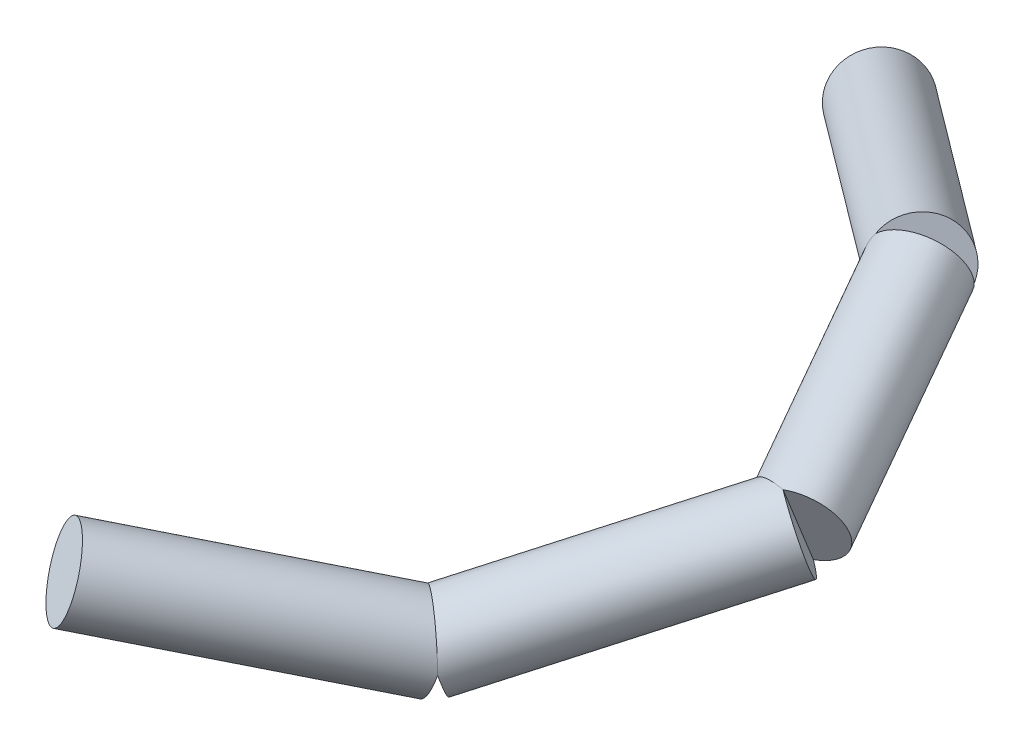
ISO-10303-21;
HEADER;
FILE_DESCRIPTION(('STEP AP214'),'2;1');
FILE_NAME('part.step','',(''),(''),'','','');
FILE_SCHEMA(('AUTOMOTIVE_DESIGN { 1 0 10303 214 1 1 1 1 }'));
ENDSEC;
DATA;
#1=APPLICATION_CONTEXT('core data for automotive mechanical design processes');
#2=APPLICATION_PROTOCOL_DEFINITION('international standard','automotive_design',2000,#1);
#3=PRODUCT_CONTEXT('',#1,'mechanical');
#4=PRODUCT('Part','Part','',(#3));
#5=PRODUCT_RELATED_PRODUCT_CATEGORY('part','',(#4));
#6=PRODUCT_DEFINITION_FORMATION('','',#4);
#7=PRODUCT_DEFINITION_CONTEXT('part definition',#1,'design');
#8=PRODUCT_DEFINITION('design','',#6,#7);
#9=PRODUCT_DEFINITION_SHAPE('','',#8);
#10=(LENGTH_UNIT() NAMED_UNIT(*) SI_UNIT(.MILLI.,.METRE.));
#11=(NAMED_UNIT(*) PLANE_ANGLE_UNIT() SI_UNIT($,.RADIAN.));
#12=(NAMED_UNIT(*) SI_UNIT($,.STERADIAN.) SOLID_ANGLE_UNIT());
#13=UNCERTAINTY_MEASURE_WITH_UNIT(LENGTH_MEASURE(1.E-05),#10,'distance_accuracy_value','');
#14=(GEOMETRIC_REPRESENTATION_CONTEXT(3) GLOBAL_UNCERTAINTY_ASSIGNED_CONTEXT((#13)) GLOBAL_UNIT_ASSIGNED_CONTEXT((#10,
#11,#12)) REPRESENTATION_CONTEXT('',''));
#15=CARTESIAN_POINT('',(0.,0.,0.));
#16=DIRECTION('',(0.,0.,1.));
#17=DIRECTION('',(1.,0.,0.));
#18=AXIS2_PLACEMENT_3D('',#15,#16,#17);
#19=CARTESIAN_POINT('',(0.,0.,0.));
#20=DIRECTION('',(0.744208407535235,0.248069469178078,0.620173672946196));
#21=DIRECTION('',(0.,-0.928476690885466,0.371390676353587));
#22=AXIS2_PLACEMENT_3D('',#19,#20,#21);
#23=PLANE('',#22);
#24=CARTESIAN_POINT('',(0.,0.,0.));
#25=DIRECTION('',(0.744208407535374,0.248069469178054,0.62017367294604));
#26=DIRECTION('',(0.658156305651327,-0.113947898116057,-0.744208407535369));
#27=AXIS2_PLACEMENT_3D('',#24,#25,#26);
#28=CIRCLE('',#27,10.);
#29=CARTESIAN_POINT('',(6.581563056514,-1.139478981162,-7.442084075353));
#30=VERTEX_POINT('',#29);
#31=EDGE_CURVE('E10',#30,#30,#28,.T.);
#32=ORIENTED_EDGE('',*,*,#31,.F.);
#33=EDGE_LOOP('',(#32));
#34=FACE_BOUND('',#33,.T.);
#35=ADVANCED_FACE('F16',(#34),#23,.F.);
#36=CARTESIAN_POINT('',(60.,20.,50.));
#37=DIRECTION('',(0.744208407535235,0.248069469178078,0.620173672946196));
#38=DIRECTION('',(0.,-0.928476690885466,0.371390676353587));
#39=AXIS2_PLACEMENT_3D('',#36,#37,#38);
#40=PLANE('',#39);
#41=CARTESIAN_POINT('',(60.,20.,50.));
#42=DIRECTION('',(0.744208407535374,0.248069469178054,0.62017367294604));
#43=DIRECTION('',(0.658156305651327,-0.113947898116057,-0.744208407535369));
#44=AXIS2_PLACEMENT_3D('',#41,#42,#43);
#45=CIRCLE('',#44,10.);
#46=CARTESIAN_POINT('',(66.154574548967,13.845425451033,45.076340360827));
#47=VERTEX_POINT('',#46);
#48=CARTESIAN_POINT('',(66.581563056514,18.860521018838,42.557915924647));
#49=VERTEX_POINT('',#48);
#50=EDGE_CURVE('E64',#47,#49,#45,.T.);
#51=ORIENTED_EDGE('',*,*,#50,.T.);
#52=CARTESIAN_POINT('',(60.,20.,50.));
#53=DIRECTION('',(0.744208407535374,0.248069469178054,0.62017367294604));
#54=DIRECTION('',(0.658156305651327,-0.113947898116057,-0.744208407535369));
#55=AXIS2_PLACEMENT_3D('',#52,#53,#54);
#56=CIRCLE('',#55,10.);
#57=CARTESIAN_POINT('',(53.845425451033,26.154574548966,54.923659639174));
#58=VERTEX_POINT('',#57);
#59=EDGE_CURVE('E20',#49,#58,#56,.T.);
#60=ORIENTED_EDGE('',*,*,#59,.T.);
#61=DIRECTION('',(0.615457454896845,-0.615457454896845,-0.492365963916876));
#62=VECTOR('',#61,1.);
#63=CARTESIAN_POINT('',(60.,20.,50.));
#64=LINE('',#63,#62);
#65=EDGE_CURVE('E62',#58,#47,#64,.T.);
#66=ORIENTED_EDGE('',*,*,#65,.T.);
#67=EDGE_LOOP('',(#51,#60,#66));
#68=FACE_BOUND('',#67,.T.);
#69=ADVANCED_FACE('F18',(#68),#40,.T.);
#70=CARTESIAN_POINT('',(0.,0.,0.));
#71=DIRECTION('',(0.744208407535374,0.248069469178054,0.62017367294604));
#72=DIRECTION('',(0.658156305651327,-0.113947898116057,-0.744208407535369));
#73=AXIS2_PLACEMENT_3D('',#70,#71,#72);
#74=CYLINDRICAL_SURFACE('',#73,10.);
#75=DIRECTION('',(0.744208407535235,0.248069469178078,0.620173672946196));
#76=VECTOR('',#75,1.);
#77=CARTESIAN_POINT('',(6.581563056514,-1.139478981162,-7.442084075353));
#78=LINE('',#77,#76);
#79=EDGE_CURVE('E75',#30,#49,#78,.T.);
#80=ORIENTED_EDGE('',*,*,#79,.T.);
#81=ORIENTED_EDGE('',*,*,#50,.F.);
#82=CARTESIAN_POINT('',(60.,20.,50.));
#83=DIRECTION('',(0.590246976570918,-0.0540803077025076,0.805409105341932));
#84=DIRECTION('',(0.522322340955084,0.786312559693127,-0.329987773422053));
#85=AXIS2_PLACEMENT_3D('',#82,#83,#84);
#86=ELLIPSE('',#85,10.806784701162,10.);
#87=EDGE_CURVE('E78',#58,#47,#86,.T.);
#88=ORIENTED_EDGE('',*,*,#87,.F.);
#89=ORIENTED_EDGE('',*,*,#59,.F.);
#90=ORIENTED_EDGE('',*,*,#79,.F.);
#91=ORIENTED_EDGE('',*,*,#31,.T.);
#92=EDGE_LOOP('',(#80,#81,#88,#89,#90,#91));
#93=FACE_BOUND('',#92,.T.);
#94=ADVANCED_FACE('F79',(#93),#74,.T.);
#95=CARTESIAN_POINT('',(60.,20.,50.));
#96=DIRECTION('',(0.348155311911244,-0.348155311911244,0.87038827977861));
#97=DIRECTION('',(-0.707106781186548,-0.707106781186548,0.));
#98=AXIS2_PLACEMENT_3D('',#95,#96,#97);
#99=PLANE('',#98);
#100=ORIENTED_EDGE('',*,*,#65,.F.);
#101=CARTESIAN_POINT('',(60.,20.,50.));
#102=DIRECTION('',(0.348155311911166,-0.34815531191125,0.870388279778639));
#103=DIRECTION('',(0.935194139889343,0.0648058601107837,-0.348155311911128));
#104=AXIS2_PLACEMENT_3D('',#101,#102,#103);
#105=CIRCLE('',#104,10.);
#106=CARTESIAN_POINT('',(69.351941398892,20.648058601108,46.518446880886));
#107=VERTEX_POINT('',#106);
#108=EDGE_CURVE('E70',#107,#58,#105,.T.);
#109=ORIENTED_EDGE('',*,*,#108,.F.);
#110=CARTESIAN_POINT('',(60.,20.,50.));
#111=DIRECTION('',(0.348155311911166,-0.34815531191125,0.870388279778639));
#112=DIRECTION('',(0.935194139889343,0.0648058601107837,-0.348155311911128));
#113=AXIS2_PLACEMENT_3D('',#110,#111,#112);
#114=CIRCLE('',#113,10.);
#115=EDGE_CURVE('E72',#47,#107,#114,.T.);
#116=ORIENTED_EDGE('',*,*,#115,.F.);
#117=EDGE_LOOP('',(#100,#109,#116));
#118=FACE_BOUND('',#117,.T.);
#119=ADVANCED_FACE('F68',(#118),#99,.F.);
#120=CARTESIAN_POINT('',(80.,0.,100.));
#121=DIRECTION('',(0.348155311911244,-0.348155311911244,0.87038827977861));
#122=DIRECTION('',(-0.707106781186548,-0.707106781186548,0.));
#123=AXIS2_PLACEMENT_3D('',#120,#121,#122);
#124=PLANE('',#123);
#125=CARTESIAN_POINT('',(80.,0.,100.));
#126=DIRECTION('',(0.348155311911166,-0.34815531191125,0.870388279778639));
#127=DIRECTION('',(0.935194139889343,0.0648058601107837,-0.348155311911128));
#128=AXIS2_PLACEMENT_3D('',#125,#126,#127);
#129=CIRCLE('',#128,10.);
#130=CARTESIAN_POINT('',(80.,-9.284766908853,96.286093236459));
#131=VERTEX_POINT('',#130);
#132=CARTESIAN_POINT('',(89.351941398892,0.648058601108,96.518446880886));
#133=VERTEX_POINT('',#132);
#134=EDGE_CURVE('E76',#131,#133,#129,.T.);
#135=ORIENTED_EDGE('',*,*,#134,.T.);
#136=CARTESIAN_POINT('',(80.,0.,100.));
#137=DIRECTION('',(0.348155311911166,-0.34815531191125,0.870388279778639));
#138=DIRECTION('',(0.935194139889343,0.0648058601107837,-0.348155311911128));
#139=AXIS2_PLACEMENT_3D('',#136,#137,#138);
#140=CIRCLE('',#139,10.);
#141=CARTESIAN_POINT('',(80.,9.284766908853,103.71390676354));
#142=VERTEX_POINT('',#141);
#143=EDGE_CURVE('E93',#133,#142,#140,.T.);
#144=ORIENTED_EDGE('',*,*,#143,.T.);
#145=DIRECTION('',(0.,-0.928476690885259,-0.371390676354104));
#146=VECTOR('',#145,1.);
#147=CARTESIAN_POINT('',(80.,0.,100.));
#148=LINE('',#147,#146);
#149=EDGE_CURVE('E111',#142,#131,#148,.T.);
#150=ORIENTED_EDGE('',*,*,#149,.T.);
#151=EDGE_LOOP('',(#135,#144,#150));
#152=FACE_BOUND('',#151,.T.);
#153=ADVANCED_FACE('F168',(#152),#124,.T.);
#154=CARTESIAN_POINT('',(60.,20.,50.));
#155=DIRECTION('',(0.348155311911166,-0.34815531191125,0.87038827977864));
#156=DIRECTION('',(0.935194139889343,0.0648058601107837,-0.348155311911128));
#157=AXIS2_PLACEMENT_3D('',#154,#155,#156);
#158=CYLINDRICAL_SURFACE('',#157,10.);
#159=ORIENTED_EDGE('',*,*,#143,.F.);
#160=DIRECTION('',(0.348155311911244,-0.348155311911244,0.87038827977861));
#161=VECTOR('',#160,1.);
#162=CARTESIAN_POINT('',(69.351941398892,20.648058601108,46.518446880886));
#163=LINE('',#162,#161);
#164=EDGE_CURVE('E86',#107,#133,#163,.T.);
#165=ORIENTED_EDGE('',*,*,#164,.F.);
#166=ORIENTED_EDGE('',*,*,#108,.T.);
#167=ORIENTED_EDGE('',*,*,#87,.T.);
#168=ORIENTED_EDGE('',*,*,#115,.T.);
#169=ORIENTED_EDGE('',*,*,#164,.T.);
#170=ORIENTED_EDGE('',*,*,#134,.F.);
#171=CARTESIAN_POINT('',(80.,0.,100.));
#172=DIRECTION('',(-0.141158248431731,-0.367671958155124,0.919179895388309));
#173=DIRECTION('',(0.989987044814065,-0.0524248573581335,0.131062143395009));
#174=AXIS2_PLACEMENT_3D('',#171,#172,#173);
#175=ELLIPSE('',#174,11.377789309345,10.);
#176=EDGE_CURVE('E271',#142,#131,#175,.T.);
#177=ORIENTED_EDGE('',*,*,#176,.F.);
#178=EDGE_LOOP('',(#159,#165,#166,#167,#168,#169,#170,#177));
#179=FACE_BOUND('',#178,.T.);
#180=ADVANCED_FACE('F84',(#179),#158,.T.);
#181=CARTESIAN_POINT('',(80.,0.,100.));
#182=DIRECTION('',(-0.596284793999944,-0.298142396999972,0.74535599249993));
#183=DIRECTION('',(-0.447213595499958,0.894427190999916,0.));
#184=AXIS2_PLACEMENT_3D('',#181,#182,#183);
#185=PLANE('',#184);
#186=ORIENTED_EDGE('',*,*,#149,.F.);
#187=CARTESIAN_POINT('',(80.,0.,100.));
#188=DIRECTION('',(-0.596284793999944,-0.298142396999972,0.74535599249993));
#189=DIRECTION('',(0.79628479399994,-0.101857602999992,0.596284793999955));
#190=AXIS2_PLACEMENT_3D('',#187,#188,#189);
#191=CIRCLE('',#190,10.);
#192=CARTESIAN_POINT('',(87.962847939999,-1.01857603,105.96284793999));
#193=VERTEX_POINT('',#192);
#194=EDGE_CURVE('E102',#193,#142,#191,.T.);
#195=ORIENTED_EDGE('',*,*,#194,.F.);
#196=CARTESIAN_POINT('',(80.,0.,100.));
#197=DIRECTION('',(-0.596284793999944,-0.298142396999972,0.74535599249993));
#198=DIRECTION('',(0.79628479399994,-0.101857602999992,0.596284793999955));
#199=AXIS2_PLACEMENT_3D('',#196,#197,#198);
#200=CIRCLE('',#199,10.);
#201=EDGE_CURVE('E109',#131,#193,#200,.T.);
#202=ORIENTED_EDGE('',*,*,#201,.F.);
#203=EDGE_LOOP('',(#186,#195,#202));
#204=FACE_BOUND('',#203,.T.);
#205=ADVANCED_FACE('F198',(#204),#185,.F.);
#206=CARTESIAN_POINT('',(40.,-20.,150.));
#207=DIRECTION('',(-0.596284793999944,-0.298142396999972,0.74535599249993));
#208=DIRECTION('',(-0.447213595499958,0.894427190999916,0.));
#209=AXIS2_PLACEMENT_3D('',#206,#207,#208);
#210=PLANE('',#209);
#211=CARTESIAN_POINT('',(40.,-20.,150.));
#212=DIRECTION('',(-0.596284793999944,-0.298142396999972,0.74535599249993));
#213=DIRECTION('',(0.79628479399994,-0.101857602999992,0.596284793999955));
#214=AXIS2_PLACEMENT_3D('',#211,#212,#213);
#215=CIRCLE('',#214,10.);
#216=CARTESIAN_POINT('',(32.19131190557,-20.,143.75304952445));
#217=VERTEX_POINT('',#216);
#218=CARTESIAN_POINT('',(47.962847939999,-21.01857603,155.96284793999));
#219=VERTEX_POINT('',#218);
#220=EDGE_CURVE('E105',#217,#219,#215,.T.);
#221=ORIENTED_EDGE('',*,*,#220,.T.);
#222=CARTESIAN_POINT('',(40.,-20.,150.));
#223=DIRECTION('',(-0.596284793999944,-0.298142396999972,0.74535599249993));
#224=DIRECTION('',(0.79628479399994,-0.101857602999992,0.596284793999955));
#225=AXIS2_PLACEMENT_3D('',#222,#223,#224);
#226=CIRCLE('',#225,10.);
#227=CARTESIAN_POINT('',(47.80868809443,-20.,156.24695047554));
#228=VERTEX_POINT('',#227);
#229=EDGE_CURVE('E97',#219,#228,#226,.T.);
#230=ORIENTED_EDGE('',*,*,#229,.T.);
#231=DIRECTION('',(-0.780868809443226,0.,-0.62469504755418));
#232=VECTOR('',#231,1.);
#233=CARTESIAN_POINT('',(40.,-20.,150.));
#234=LINE('',#233,#232);
#235=EDGE_CURVE('E108',#228,#217,#234,.T.);
#236=ORIENTED_EDGE('',*,*,#235,.T.);
#237=EDGE_LOOP('',(#221,#230,#236));
#238=FACE_BOUND('',#237,.T.);
#239=ADVANCED_FACE('F182',(#238),#210,.T.);
#240=CARTESIAN_POINT('',(0.,0.,200.));
#241=DIRECTION('',(-0.596284793999944,0.298142396999972,0.74535599249993));
#242=DIRECTION('',(0.447213595499958,0.894427190999916,0.));
#243=AXIS2_PLACEMENT_3D('',#240,#241,#242);
#244=PLANE('',#243);
#245=CARTESIAN_POINT('',(0.,0.,200.));
#246=DIRECTION('',(-0.596284793999944,0.298142396999972,0.74535599249993));
#247=DIRECTION('',(0.79628479399994,0.101857602999992,0.596284793999955));
#248=AXIS2_PLACEMENT_3D('',#245,#246,#247);
#249=CIRCLE('',#248,10.);
#250=CARTESIAN_POINT('',(7.962847939999,1.01857603,205.96284793999));
#251=VERTEX_POINT('',#250);
#252=EDGE_CURVE('E283',#251,#251,#249,.T.);
#253=ORIENTED_EDGE('',*,*,#252,.T.);
#254=EDGE_LOOP('',(#253));
#255=FACE_BOUND('',#254,.T.);
#256=ADVANCED_FACE('F162',(#255),#244,.T.);
#257=CARTESIAN_POINT('',(40.,-20.,150.));
#258=DIRECTION('',(-0.596284793999944,0.298142396999972,0.74535599249993));
#259=DIRECTION('',(0.447213595499958,0.894427190999916,0.));
#260=AXIS2_PLACEMENT_3D('',#257,#258,#259);
#261=PLANE('',#260);
#262=CARTESIAN_POINT('',(40.,-20.,150.));
#263=DIRECTION('',(-0.596284793999944,0.298142396999972,0.74535599249993));
#264=DIRECTION('',(0.79628479399994,0.101857602999992,0.596284793999955));
#265=AXIS2_PLACEMENT_3D('',#262,#263,#264);
#266=CIRCLE('',#265,10.);
#267=EDGE_CURVE('E288',#217,#228,#266,.T.);
#268=ORIENTED_EDGE('',*,*,#267,.F.);
#269=ORIENTED_EDGE('',*,*,#235,.F.);
#270=EDGE_LOOP('',(#268,#269));
#271=FACE_BOUND('',#270,.T.);
#272=ADVANCED_FACE('F144',(#271),#261,.F.);
#273=CARTESIAN_POINT('',(80.,0.,100.));
#274=DIRECTION('',(-0.596284793999944,-0.298142396999972,0.74535599249993));
#275=DIRECTION('',(0.79628479399994,-0.101857602999992,0.596284793999955));
#276=AXIS2_PLACEMENT_3D('',#273,#274,#275);
#277=CYLINDRICAL_SURFACE('',#276,10.);
#278=ORIENTED_EDGE('',*,*,#229,.F.);
#279=DIRECTION('',(-0.596284793999944,-0.298142396999972,0.74535599249993));
#280=VECTOR('',#279,1.);
#281=CARTESIAN_POINT('',(87.962847939999,-1.01857603,105.96284793999));
#282=LINE('',#281,#280);
#283=EDGE_CURVE('E99',#193,#219,#282,.T.);
#284=ORIENTED_EDGE('',*,*,#283,.F.);
#285=ORIENTED_EDGE('',*,*,#194,.T.);
#286=ORIENTED_EDGE('',*,*,#176,.T.);
#287=ORIENTED_EDGE('',*,*,#201,.T.);
#288=ORIENTED_EDGE('',*,*,#283,.T.);
#289=ORIENTED_EDGE('',*,*,#220,.F.);
#290=CARTESIAN_POINT('',(40.,-20.,150.));
#291=DIRECTION('',(-0.62469504755418,0.,0.780868809443225));
#292=DIRECTION('',(0.,-1.,0.));
#293=AXIS2_PLACEMENT_3D('',#290,#291,#292);
#294=ELLIPSE('',#293,10.476454436544,10.);
#295=CARTESIAN_POINT('',(47.76410139756,-18.88205069878,156.21128111804));
#296=VERTEX_POINT('',#295);
#297=EDGE_CURVE('E284',#296,#217,#294,.T.);
#298=ORIENTED_EDGE('',*,*,#297,.F.);
#299=CARTESIAN_POINT('',(40.,-20.,150.));
#300=DIRECTION('',(-0.62469504755418,0.,0.780868809443225));
#301=DIRECTION('',(0.,-1.,0.));
#302=AXIS2_PLACEMENT_3D('',#299,#300,#301);
#303=ELLIPSE('',#302,10.476454436544,10.);
#304=EDGE_CURVE('E292',#228,#296,#303,.T.);
#305=ORIENTED_EDGE('',*,*,#304,.F.);
#306=EDGE_LOOP('',(#278,#284,#285,#286,#287,#288,#289,#298,#305));
#307=FACE_BOUND('',#306,.T.);
#308=ADVANCED_FACE('F134',(#307),#277,.T.);
#309=CARTESIAN_POINT('',(40.,-20.,150.));
#310=DIRECTION('',(-0.596284793999944,0.298142396999972,0.74535599249993));
#311=DIRECTION('',(0.79628479399994,0.101857602999992,0.596284793999955));
#312=AXIS2_PLACEMENT_3D('',#309,#310,#311);
#313=CYLINDRICAL_SURFACE('',#312,10.);
#314=DIRECTION('',(-0.596284793999944,0.298142396999972,0.74535599249993));
#315=VECTOR('',#314,1.);
#316=CARTESIAN_POINT('',(47.962847939999,-18.98142397,155.96284793999));
#317=LINE('',#316,#315);
#318=EDGE_CURVE('E282',#296,#251,#317,.T.);
#319=ORIENTED_EDGE('',*,*,#318,.T.);
#320=ORIENTED_EDGE('',*,*,#252,.F.);
#321=ORIENTED_EDGE('',*,*,#318,.F.);
#322=ORIENTED_EDGE('',*,*,#297,.T.);
#323=ORIENTED_EDGE('',*,*,#267,.T.);
#324=ORIENTED_EDGE('',*,*,#304,.T.);
#325=EDGE_LOOP('',(#319,#320,#321,#322,#323,#324));
#326=FACE_BOUND('',#325,.T.);
#327=ADVANCED_FACE('F129',(#326),#313,.T.);
#328=CLOSED_SHELL('',(#35,#69,#94,#119,#153,#180,#205,#239,#256,#272,#308,#327));
#329=MANIFOLD_SOLID_BREP('B1',#328);
#330=ADVANCED_BREP_SHAPE_REPRESENTATION('',(#18,#329),#14);
#331=SHAPE_DEFINITION_REPRESENTATION(#9,#330);
ENDSEC;
END-ISO-10303-21;
